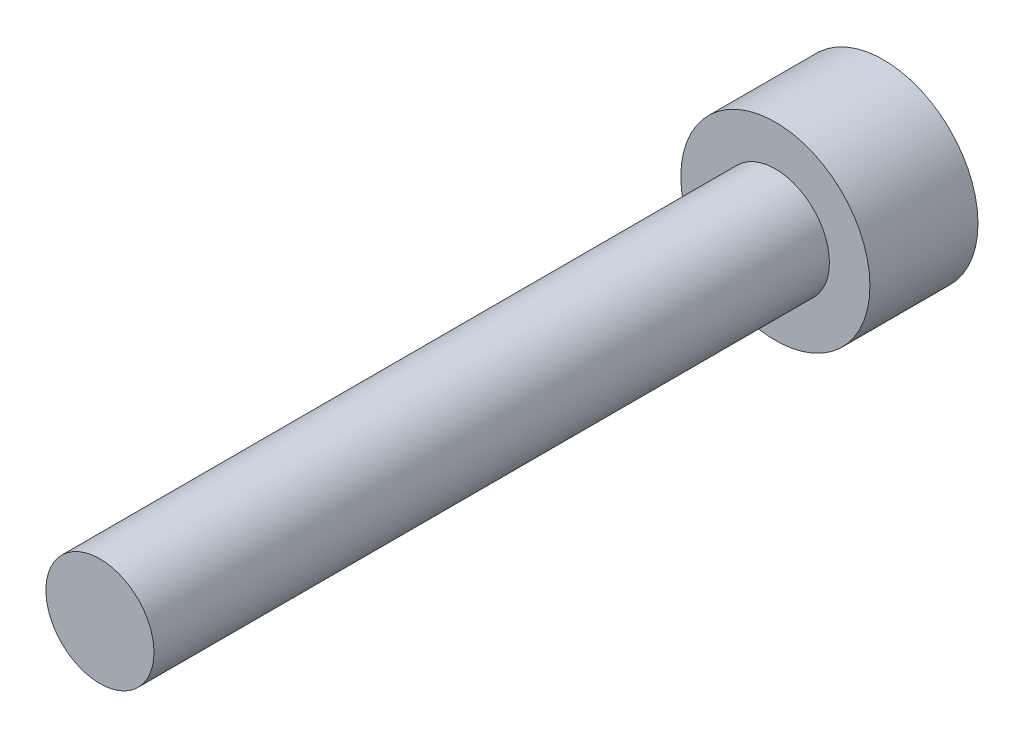
ISO-10303-21;
HEADER;
FILE_DESCRIPTION(('STEP AP214'),'2;1');
FILE_NAME('part.step','',(''),(''),'','','');
FILE_SCHEMA(('AUTOMOTIVE_DESIGN { 1 0 10303 214 1 1 1 1 }'));
ENDSEC;
DATA;
#1=APPLICATION_CONTEXT('core data for automotive mechanical design processes');
#2=APPLICATION_PROTOCOL_DEFINITION('international standard','automotive_design',2000,#1);
#3=PRODUCT_CONTEXT('',#1,'mechanical');
#4=PRODUCT('Part','Part','',(#3));
#5=PRODUCT_RELATED_PRODUCT_CATEGORY('part','',(#4));
#6=PRODUCT_DEFINITION_FORMATION('','',#4);
#7=PRODUCT_DEFINITION_CONTEXT('part definition',#1,'design');
#8=PRODUCT_DEFINITION('design','',#6,#7);
#9=PRODUCT_DEFINITION_SHAPE('','',#8);
#10=(LENGTH_UNIT() NAMED_UNIT(*) SI_UNIT(.MILLI.,.METRE.));
#11=(NAMED_UNIT(*) PLANE_ANGLE_UNIT() SI_UNIT($,.RADIAN.));
#12=(NAMED_UNIT(*) SI_UNIT($,.STERADIAN.) SOLID_ANGLE_UNIT());
#13=UNCERTAINTY_MEASURE_WITH_UNIT(LENGTH_MEASURE(1.E-05),#10,'distance_accuracy_value','');
#14=(GEOMETRIC_REPRESENTATION_CONTEXT(3) GLOBAL_UNCERTAINTY_ASSIGNED_CONTEXT((#13)) GLOBAL_UNIT_ASSIGNED_CONTEXT((#10,
#11,#12)) REPRESENTATION_CONTEXT('',''));
#15=CARTESIAN_POINT('',(0.,0.,0.));
#16=DIRECTION('',(0.,0.,1.));
#17=DIRECTION('',(1.,0.,0.));
#18=AXIS2_PLACEMENT_3D('',#15,#16,#17);
#19=CARTESIAN_POINT('',(0.,0.,25.));
#20=DIRECTION('',(0.,0.,1.));
#21=DIRECTION('',(1.00000000000001,0.,0.));
#22=AXIS2_PLACEMENT_3D('',#19,#20,#21);
#23=PLANE('',#22);
#24=CARTESIAN_POINT('',(0.,0.,25.));
#25=DIRECTION('',(0.,0.,1.));
#26=DIRECTION('',(1.00000000000001,0.,0.));
#27=AXIS2_PLACEMENT_3D('',#24,#25,#26);
#28=CIRCLE('',#27,2.);
#29=CARTESIAN_POINT('',(2.00000000000002,0.,25.));
#30=VERTEX_POINT('',#29);
#31=EDGE_CURVE('E10',#30,#30,#28,.T.);
#32=ORIENTED_EDGE('',*,*,#31,.T.);
#33=EDGE_LOOP('',(#32));
#34=FACE_BOUND('',#33,.T.);
#35=ADVANCED_FACE('F15',(#34),#23,.T.);
#36=CARTESIAN_POINT('',(0.,0.,0.));
#37=DIRECTION('',(0.,0.,-1.));
#38=DIRECTION('',(1.00000000000001,0.,0.));
#39=AXIS2_PLACEMENT_3D('',#36,#37,#38);
#40=CYLINDRICAL_SURFACE('',#39,2.);
#41=ORIENTED_EDGE('',*,*,#31,.F.);
#42=EDGE_LOOP('',(#41));
#43=FACE_BOUND('',#42,.T.);
#44=CARTESIAN_POINT('',(0.,0.,0.));
#45=DIRECTION('',(0.,0.,1.));
#46=DIRECTION('',(1.00000000000001,0.,0.));
#47=AXIS2_PLACEMENT_3D('',#44,#45,#46);
#48=CIRCLE('',#47,2.);
#49=CARTESIAN_POINT('',(2.00000000000002,0.,0.));
#50=VERTEX_POINT('',#49);
#51=EDGE_CURVE('E22',#50,#50,#48,.T.);
#52=ORIENTED_EDGE('',*,*,#51,.T.);
#53=EDGE_LOOP('',(#52));
#54=FACE_BOUND('',#53,.T.);
#55=ADVANCED_FACE('F60',(#43,#54),#40,.T.);
#56=CARTESIAN_POINT('',(0.,0.,0.));
#57=DIRECTION('',(0.,0.,1.));
#58=DIRECTION('',(1.00000000000001,0.,0.));
#59=AXIS2_PLACEMENT_3D('',#56,#57,#58);
#60=PLANE('',#59);
#61=ORIENTED_EDGE('',*,*,#51,.F.);
#62=EDGE_LOOP('',(#61));
#63=FACE_BOUND('',#62,.T.);
#64=CARTESIAN_POINT('',(0.,0.,0.));
#65=DIRECTION('',(0.,0.,1.));
#66=DIRECTION('',(1.00000000000001,0.,0.));
#67=AXIS2_PLACEMENT_3D('',#64,#65,#66);
#68=CIRCLE('',#67,3.5);
#69=CARTESIAN_POINT('',(3.50000000000003,0.,0.));
#70=VERTEX_POINT('',#69);
#71=EDGE_CURVE('E28',#70,#70,#68,.T.);
#72=ORIENTED_EDGE('',*,*,#71,.T.);
#73=EDGE_LOOP('',(#72));
#74=FACE_BOUND('',#73,.T.);
#75=ADVANCED_FACE('F48',(#63,#74),#60,.T.);
#76=CARTESIAN_POINT('',(0.,0.,-4.));
#77=DIRECTION('',(0.,0.,1.));
#78=DIRECTION('',(1.00000000000001,0.,0.));
#79=AXIS2_PLACEMENT_3D('',#76,#77,#78);
#80=PLANE('',#79);
#81=CARTESIAN_POINT('',(0.,0.,-4.));
#82=DIRECTION('',(0.,0.,1.));
#83=DIRECTION('',(1.00000000000001,0.,0.));
#84=AXIS2_PLACEMENT_3D('',#81,#82,#83);
#85=CIRCLE('',#84,3.5);
#86=CARTESIAN_POINT('',(3.50000000000003,0.,-4.));
#87=VERTEX_POINT('',#86);
#88=EDGE_CURVE('E38',#87,#87,#85,.T.);
#89=ORIENTED_EDGE('',*,*,#88,.F.);
#90=EDGE_LOOP('',(#89));
#91=FACE_BOUND('',#90,.T.);
#92=ADVANCED_FACE('F46',(#91),#80,.F.);
#93=CARTESIAN_POINT('',(0.,0.,-4.));
#94=DIRECTION('',(0.,0.,-1.));
#95=DIRECTION('',(1.00000000000001,0.,0.));
#96=AXIS2_PLACEMENT_3D('',#93,#94,#95);
#97=CYLINDRICAL_SURFACE('',#96,3.5);
#98=ORIENTED_EDGE('',*,*,#71,.F.);
#99=EDGE_LOOP('',(#98));
#100=FACE_BOUND('',#99,.T.);
#101=ORIENTED_EDGE('',*,*,#88,.T.);
#102=EDGE_LOOP('',(#101));
#103=FACE_BOUND('',#102,.T.);
#104=ADVANCED_FACE('F42',(#100,#103),#97,.T.);
#105=CLOSED_SHELL('',(#35,#55,#75,#92,#104));
#106=MANIFOLD_SOLID_BREP('B1',#105);
#107=ADVANCED_BREP_SHAPE_REPRESENTATION('',(#18,#106),#14);
#108=SHAPE_DEFINITION_REPRESENTATION(#9,#107);
ENDSEC;
END-ISO-10303-21;
